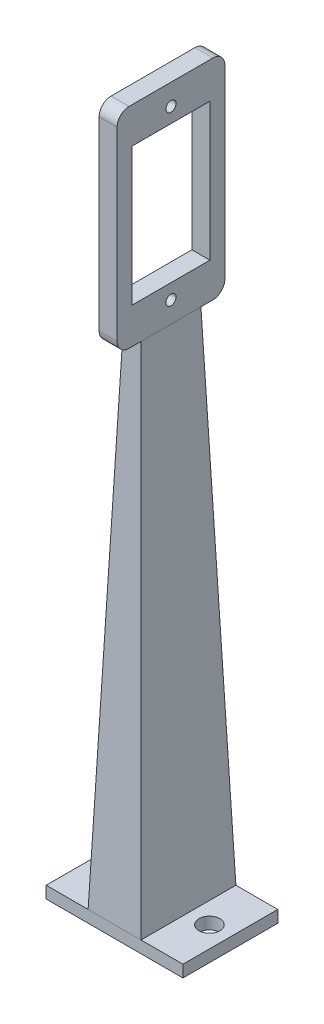
ISO-10303-21;
HEADER;
FILE_DESCRIPTION(('STEP AP214'),'2;1');
FILE_NAME('part.step','',(''),(''),'','','');
FILE_SCHEMA(('AUTOMOTIVE_DESIGN { 1 0 10303 214 1 1 1 1 }'));
ENDSEC;
DATA;
#1=APPLICATION_CONTEXT('core data for automotive mechanical design processes');
#2=APPLICATION_PROTOCOL_DEFINITION('international standard','automotive_design',2000,#1);
#3=PRODUCT_CONTEXT('',#1,'mechanical');
#4=PRODUCT('Part','Part','',(#3));
#5=PRODUCT_RELATED_PRODUCT_CATEGORY('part','',(#4));
#6=PRODUCT_DEFINITION_FORMATION('','',#4);
#7=PRODUCT_DEFINITION_CONTEXT('part definition',#1,'design');
#8=PRODUCT_DEFINITION('design','',#6,#7);
#9=PRODUCT_DEFINITION_SHAPE('','',#8);
#10=(LENGTH_UNIT() NAMED_UNIT(*) SI_UNIT(.MILLI.,.METRE.));
#11=(NAMED_UNIT(*) PLANE_ANGLE_UNIT() SI_UNIT($,.RADIAN.));
#12=(NAMED_UNIT(*) SI_UNIT($,.STERADIAN.) SOLID_ANGLE_UNIT());
#13=UNCERTAINTY_MEASURE_WITH_UNIT(LENGTH_MEASURE(1.E-05),#10,'distance_accuracy_value','');
#14=(GEOMETRIC_REPRESENTATION_CONTEXT(3) GLOBAL_UNCERTAINTY_ASSIGNED_CONTEXT((#13)) GLOBAL_UNIT_ASSIGNED_CONTEXT((#10,
#11,#12)) REPRESENTATION_CONTEXT('',''));
#15=CARTESIAN_POINT('',(0.,0.,0.));
#16=DIRECTION('',(0.,0.,1.));
#17=DIRECTION('',(1.,0.,0.));
#18=AXIS2_PLACEMENT_3D('',#15,#16,#17);
#19=CARTESIAN_POINT('',(1.5,-17.5,9.));
#20=DIRECTION('',(0.,1.,0.));
#21=DIRECTION('',(0.,0.,1.));
#22=AXIS2_PLACEMENT_3D('',#19,#20,#21);
#23=PLANE('',#22);
#24=DIRECTION('',(1.,0.,0.));
#25=VECTOR('',#24,1.);
#26=CARTESIAN_POINT('',(-1.5,-17.5,-5.));
#27=LINE('',#26,#25);
#28=CARTESIAN_POINT('',(-1.5,-17.5,-5.));
#29=VERTEX_POINT('',#28);
#30=CARTESIAN_POINT('',(1.5,-17.5,-5.));
#31=VERTEX_POINT('',#30);
#32=EDGE_CURVE('E200',#29,#31,#27,.T.);
#33=ORIENTED_EDGE('',*,*,#32,.F.);
#34=DIRECTION('',(0.,0.,-1.));
#35=VECTOR('',#34,1.);
#36=CARTESIAN_POINT('',(-1.5,-17.5,9.));
#37=LINE('',#36,#35);
#38=CARTESIAN_POINT('',(-1.5,-17.5,-7.));
#39=VERTEX_POINT('',#38);
#40=EDGE_CURVE('E302',#29,#39,#37,.T.);
#41=ORIENTED_EDGE('',*,*,#40,.T.);
#42=DIRECTION('',(-1.,0.,0.));
#43=VECTOR('',#42,1.);
#44=CARTESIAN_POINT('',(1.5,-17.5,-7.));
#45=LINE('',#44,#43);
#46=CARTESIAN_POINT('',(1.5,-17.5,-7.));
#47=VERTEX_POINT('',#46);
#48=EDGE_CURVE('E293',#39,#47,#45,.F.);
#49=ORIENTED_EDGE('',*,*,#48,.T.);
#50=DIRECTION('',(0.,0.,-1.));
#51=VECTOR('',#50,1.);
#52=CARTESIAN_POINT('',(1.5,-17.5,9.));
#53=LINE('',#52,#51);
#54=EDGE_CURVE('E47',#31,#47,#53,.T.);
#55=ORIENTED_EDGE('',*,*,#54,.F.);
#56=EDGE_LOOP('',(#33,#41,#49,#55));
#57=FACE_BOUND('',#56,.T.);
#58=ADVANCED_FACE('F32',(#57),#23,.F.);
#59=DIRECTION('',(-1.,0.,0.));
#60=VECTOR('',#59,1.);
#61=CARTESIAN_POINT('',(-1.5,-17.5,5.));
#62=LINE('',#61,#60);
#63=CARTESIAN_POINT('',(1.5,-17.5,5.));
#64=VERTEX_POINT('',#63);
#65=CARTESIAN_POINT('',(-1.5,-17.5,5.));
#66=VERTEX_POINT('',#65);
#67=EDGE_CURVE('E55',#64,#66,#62,.T.);
#68=ORIENTED_EDGE('',*,*,#67,.F.);
#69=CARTESIAN_POINT('',(1.5,-17.5,7.));
#70=VERTEX_POINT('',#69);
#71=EDGE_CURVE('E291',#70,#64,#53,.T.);
#72=ORIENTED_EDGE('',*,*,#71,.F.);
#73=DIRECTION('',(-1.,0.,0.));
#74=VECTOR('',#73,1.);
#75=CARTESIAN_POINT('',(1.5,-17.5,7.));
#76=LINE('',#75,#74);
#77=CARTESIAN_POINT('',(-1.5,-17.5,7.));
#78=VERTEX_POINT('',#77);
#79=EDGE_CURVE('E305',#70,#78,#76,.T.);
#80=ORIENTED_EDGE('',*,*,#79,.T.);
#81=EDGE_CURVE('E285',#78,#66,#37,.T.);
#82=ORIENTED_EDGE('',*,*,#81,.T.);
#83=EDGE_LOOP('',(#68,#72,#80,#82));
#84=FACE_BOUND('',#83,.T.);
#85=ADVANCED_FACE('F362',(#84),#23,.F.);
#86=CARTESIAN_POINT('',(1.5,-17.5,-9.));
#87=DIRECTION('',(0.,0.,1.));
#88=DIRECTION('',(1.,0.,0.));
#89=AXIS2_PLACEMENT_3D('',#86,#87,#88);
#90=PLANE('',#89);
#91=DIRECTION('',(0.,1.,0.));
#92=VECTOR('',#91,1.);
#93=CARTESIAN_POINT('',(1.5,-17.5,-9.));
#94=LINE('',#93,#92);
#95=CARTESIAN_POINT('',(1.5,-15.5,-9.));
#96=VERTEX_POINT('',#95);
#97=CARTESIAN_POINT('',(1.5,15.5,-9.));
#98=VERTEX_POINT('',#97);
#99=EDGE_CURVE('E281',#96,#98,#94,.T.);
#100=ORIENTED_EDGE('',*,*,#99,.F.);
#101=DIRECTION('',(-1.,0.,0.));
#102=VECTOR('',#101,1.);
#103=CARTESIAN_POINT('',(1.5,-15.5,-9.));
#104=LINE('',#103,#102);
#105=CARTESIAN_POINT('',(-1.5,-15.5,-9.));
#106=VERTEX_POINT('',#105);
#107=EDGE_CURVE('E332',#96,#106,#104,.T.);
#108=ORIENTED_EDGE('',*,*,#107,.T.);
#109=DIRECTION('',(0.,1.,0.));
#110=VECTOR('',#109,1.);
#111=CARTESIAN_POINT('',(-1.5,-17.5,-9.));
#112=LINE('',#111,#110);
#113=CARTESIAN_POINT('',(-1.5,15.5,-9.));
#114=VERTEX_POINT('',#113);
#115=EDGE_CURVE('E280',#106,#114,#112,.T.);
#116=ORIENTED_EDGE('',*,*,#115,.T.);
#117=DIRECTION('',(-1.,0.,0.));
#118=VECTOR('',#117,1.);
#119=CARTESIAN_POINT('',(1.5,15.5,-9.));
#120=LINE('',#119,#118);
#121=EDGE_CURVE('E330',#114,#98,#120,.F.);
#122=ORIENTED_EDGE('',*,*,#121,.T.);
#123=EDGE_LOOP('',(#100,#108,#116,#122));
#124=FACE_BOUND('',#123,.T.);
#125=ADVANCED_FACE('F418',(#124),#90,.F.);
#126=CARTESIAN_POINT('',(1.5,17.5,9.));
#127=DIRECTION('',(0.,-1.,0.));
#128=DIRECTION('',(0.,0.,-1.));
#129=AXIS2_PLACEMENT_3D('',#126,#127,#128);
#130=PLANE('',#129);
#131=DIRECTION('',(0.,0.,1.));
#132=VECTOR('',#131,1.);
#133=CARTESIAN_POINT('',(-1.5,17.5,9.));
#134=LINE('',#133,#132);
#135=CARTESIAN_POINT('',(-1.5,17.5,-7.));
#136=VERTEX_POINT('',#135);
#137=CARTESIAN_POINT('',(-1.5,17.5,7.));
#138=VERTEX_POINT('',#137);
#139=EDGE_CURVE('E296',#136,#138,#134,.T.);
#140=ORIENTED_EDGE('',*,*,#139,.T.);
#141=DIRECTION('',(-1.,0.,0.));
#142=VECTOR('',#141,1.);
#143=CARTESIAN_POINT('',(1.5,17.5,7.));
#144=LINE('',#143,#142);
#145=CARTESIAN_POINT('',(1.5,17.5,7.));
#146=VERTEX_POINT('',#145);
#147=EDGE_CURVE('E11',#138,#146,#144,.F.);
#148=ORIENTED_EDGE('',*,*,#147,.T.);
#149=DIRECTION('',(0.,0.,1.));
#150=VECTOR('',#149,1.);
#151=CARTESIAN_POINT('',(1.5,17.5,9.));
#152=LINE('',#151,#150);
#153=CARTESIAN_POINT('',(1.5,17.5,-7.));
#154=VERTEX_POINT('',#153);
#155=EDGE_CURVE('E284',#154,#146,#152,.T.);
#156=ORIENTED_EDGE('',*,*,#155,.F.);
#157=DIRECTION('',(-1.,0.,0.));
#158=VECTOR('',#157,1.);
#159=CARTESIAN_POINT('',(1.5,17.5,-7.));
#160=LINE('',#159,#158);
#161=EDGE_CURVE('E40',#154,#136,#160,.T.);
#162=ORIENTED_EDGE('',*,*,#161,.T.);
#163=EDGE_LOOP('',(#140,#148,#156,#162));
#164=FACE_BOUND('',#163,.T.);
#165=ADVANCED_FACE('F339',(#164),#130,.F.);
#166=CARTESIAN_POINT('',(1.5,-17.5,9.));
#167=DIRECTION('',(0.,0.,-1.));
#168=DIRECTION('',(-1.,0.,0.));
#169=AXIS2_PLACEMENT_3D('',#166,#167,#168);
#170=PLANE('',#169);
#171=DIRECTION('',(0.,-1.,0.));
#172=VECTOR('',#171,1.);
#173=CARTESIAN_POINT('',(-1.5,-17.5,9.));
#174=LINE('',#173,#172);
#175=CARTESIAN_POINT('',(-1.5,15.5,9.));
#176=VERTEX_POINT('',#175);
#177=CARTESIAN_POINT('',(-1.5,-15.5,9.));
#178=VERTEX_POINT('',#177);
#179=EDGE_CURVE('E299',#176,#178,#174,.T.);
#180=ORIENTED_EDGE('',*,*,#179,.T.);
#181=DIRECTION('',(-1.,0.,0.));
#182=VECTOR('',#181,1.);
#183=CARTESIAN_POINT('',(1.5,-15.5,9.));
#184=LINE('',#183,#182);
#185=CARTESIAN_POINT('',(1.5,-15.5,9.));
#186=VERTEX_POINT('',#185);
#187=EDGE_CURVE('E320',#178,#186,#184,.F.);
#188=ORIENTED_EDGE('',*,*,#187,.T.);
#189=DIRECTION('',(0.,-1.,0.));
#190=VECTOR('',#189,1.);
#191=CARTESIAN_POINT('',(1.5,-17.5,9.));
#192=LINE('',#191,#190);
#193=CARTESIAN_POINT('',(1.5,15.5,9.));
#194=VERTEX_POINT('',#193);
#195=EDGE_CURVE('E288',#194,#186,#192,.T.);
#196=ORIENTED_EDGE('',*,*,#195,.F.);
#197=DIRECTION('',(-1.,0.,0.));
#198=VECTOR('',#197,1.);
#199=CARTESIAN_POINT('',(1.5,15.5,9.));
#200=LINE('',#199,#198);
#201=EDGE_CURVE('E317',#194,#176,#200,.T.);
#202=ORIENTED_EDGE('',*,*,#201,.T.);
#203=EDGE_LOOP('',(#180,#188,#196,#202));
#204=FACE_BOUND('',#203,.T.);
#205=ADVANCED_FACE('F354',(#204),#170,.F.);
#206=CARTESIAN_POINT('',(1.5,0.,0.));
#207=DIRECTION('',(-1.,0.,0.));
#208=DIRECTION('',(0.,0.,1.));
#209=AXIS2_PLACEMENT_3D('',#206,#207,#208);
#210=PLANE('',#209);
#211=CARTESIAN_POINT('',(1.5,-14.,0.));
#212=DIRECTION('',(-1.,0.,0.));
#213=DIRECTION('',(0.,0.,1.));
#214=AXIS2_PLACEMENT_3D('',#211,#212,#213);
#215=CIRCLE('',#214,0.85);
#216=CARTESIAN_POINT('',(1.5,-14.,0.85));
#217=VERTEX_POINT('',#216);
#218=EDGE_CURVE('E239',#217,#217,#215,.F.);
#219=ORIENTED_EDGE('',*,*,#218,.F.);
#220=EDGE_LOOP('',(#219));
#221=FACE_BOUND('',#220,.T.);
#222=CARTESIAN_POINT('',(1.5,14.,0.));
#223=DIRECTION('',(-1.,0.,0.));
#224=DIRECTION('',(0.,0.,1.));
#225=AXIS2_PLACEMENT_3D('',#222,#223,#224);
#226=CIRCLE('',#225,0.85);
#227=CARTESIAN_POINT('',(1.5,14.,0.85));
#228=VERTEX_POINT('',#227);
#229=EDGE_CURVE('E245',#228,#228,#226,.F.);
#230=ORIENTED_EDGE('',*,*,#229,.F.);
#231=EDGE_LOOP('',(#230));
#232=FACE_BOUND('',#231,.T.);
#233=DIRECTION('',(0.,0.,-1.));
#234=VECTOR('',#233,1.);
#235=CARTESIAN_POINT('',(1.5,-11.5,-6.5));
#236=LINE('',#235,#234);
#237=CARTESIAN_POINT('',(1.5,-11.5,6.5));
#238=VERTEX_POINT('',#237);
#239=CARTESIAN_POINT('',(1.5,-11.5,-6.5));
#240=VERTEX_POINT('',#239);
#241=EDGE_CURVE('E259',#238,#240,#236,.T.);
#242=ORIENTED_EDGE('',*,*,#241,.F.);
#243=DIRECTION('',(0.,-1.,0.));
#244=VECTOR('',#243,1.);
#245=CARTESIAN_POINT('',(1.5,-11.5,6.5));
#246=LINE('',#245,#244);
#247=CARTESIAN_POINT('',(1.5,11.5,6.5));
#248=VERTEX_POINT('',#247);
#249=EDGE_CURVE('E257',#248,#238,#246,.T.);
#250=ORIENTED_EDGE('',*,*,#249,.F.);
#251=DIRECTION('',(0.,0.,1.));
#252=VECTOR('',#251,1.);
#253=CARTESIAN_POINT('',(1.5,11.5,-6.5));
#254=LINE('',#253,#252);
#255=CARTESIAN_POINT('',(1.5,11.5,-6.5));
#256=VERTEX_POINT('',#255);
#257=EDGE_CURVE('E265',#256,#248,#254,.T.);
#258=ORIENTED_EDGE('',*,*,#257,.F.);
#259=DIRECTION('',(0.,1.,0.));
#260=VECTOR('',#259,1.);
#261=CARTESIAN_POINT('',(1.5,-11.5,-6.5));
#262=LINE('',#261,#260);
#263=EDGE_CURVE('E262',#240,#256,#262,.T.);
#264=ORIENTED_EDGE('',*,*,#263,.F.);
#265=EDGE_LOOP('',(#242,#250,#258,#264));
#266=FACE_BOUND('',#265,.T.);
#267=ORIENTED_EDGE('',*,*,#195,.T.);
#268=CARTESIAN_POINT('',(1.5,-15.5,7.));
#269=DIRECTION('',(-1.,0.,0.));
#270=DIRECTION('',(0.,0.,1.));
#271=AXIS2_PLACEMENT_3D('',#268,#269,#270);
#272=CIRCLE('',#271,2.);
#273=EDGE_CURVE('E328',#186,#70,#272,.F.);
#274=ORIENTED_EDGE('',*,*,#273,.T.);
#275=ORIENTED_EDGE('',*,*,#71,.T.);
#276=DIRECTION('',(0.,0.,1.));
#277=VECTOR('',#276,1.);
#278=CARTESIAN_POINT('',(1.5,-17.5,5.));
#279=LINE('',#278,#277);
#280=EDGE_CURVE('E208',#31,#64,#279,.T.);
#281=ORIENTED_EDGE('',*,*,#280,.F.);
#282=ORIENTED_EDGE('',*,*,#54,.T.);
#283=CARTESIAN_POINT('',(1.5,-15.5,-7.));
#284=DIRECTION('',(-1.,0.,0.));
#285=DIRECTION('',(0.,0.,1.));
#286=AXIS2_PLACEMENT_3D('',#283,#284,#285);
#287=CIRCLE('',#286,2.);
#288=EDGE_CURVE('E326',#47,#96,#287,.F.);
#289=ORIENTED_EDGE('',*,*,#288,.T.);
#290=ORIENTED_EDGE('',*,*,#99,.T.);
#291=CARTESIAN_POINT('',(1.5,15.5,-7.));
#292=DIRECTION('',(-1.,0.,0.));
#293=DIRECTION('',(0.,0.,1.));
#294=AXIS2_PLACEMENT_3D('',#291,#292,#293);
#295=CIRCLE('',#294,2.);
#296=EDGE_CURVE('E322',#98,#154,#295,.F.);
#297=ORIENTED_EDGE('',*,*,#296,.T.);
#298=ORIENTED_EDGE('',*,*,#155,.T.);
#299=CARTESIAN_POINT('',(1.5,15.5,7.));
#300=DIRECTION('',(-1.,0.,0.));
#301=DIRECTION('',(0.,0.,1.));
#302=AXIS2_PLACEMENT_3D('',#299,#300,#301);
#303=CIRCLE('',#302,2.);
#304=EDGE_CURVE('E324',#146,#194,#303,.F.);
#305=ORIENTED_EDGE('',*,*,#304,.T.);
#306=EDGE_LOOP('',(#267,#274,#275,#281,#282,#289,#290,#297,#298,#305));
#307=FACE_BOUND('',#306,.T.);
#308=ADVANCED_FACE('F358',(#221,#232,#266,#307),#210,.F.);
#309=CARTESIAN_POINT('',(-1.5,0.,0.));
#310=DIRECTION('',(-1.,0.,0.));
#311=DIRECTION('',(0.,0.,1.));
#312=AXIS2_PLACEMENT_3D('',#309,#310,#311);
#313=PLANE('',#312);
#314=CARTESIAN_POINT('',(-1.5,-14.,0.));
#315=DIRECTION('',(-1.,0.,0.));
#316=DIRECTION('',(0.,0.,1.));
#317=AXIS2_PLACEMENT_3D('',#314,#315,#316);
#318=CIRCLE('',#317,0.85);
#319=CARTESIAN_POINT('',(-1.5,-14.,0.85));
#320=VERTEX_POINT('',#319);
#321=EDGE_CURVE('E216',#320,#320,#318,.T.);
#322=ORIENTED_EDGE('',*,*,#321,.F.);
#323=EDGE_LOOP('',(#322));
#324=FACE_BOUND('',#323,.T.);
#325=CARTESIAN_POINT('',(-1.5,14.,0.));
#326=DIRECTION('',(-1.,0.,0.));
#327=DIRECTION('',(0.,0.,1.));
#328=AXIS2_PLACEMENT_3D('',#325,#326,#327);
#329=CIRCLE('',#328,0.85);
#330=CARTESIAN_POINT('',(-1.5,14.,0.85));
#331=VERTEX_POINT('',#330);
#332=EDGE_CURVE('E242',#331,#331,#329,.T.);
#333=ORIENTED_EDGE('',*,*,#332,.F.);
#334=EDGE_LOOP('',(#333));
#335=FACE_BOUND('',#334,.T.);
#336=DIRECTION('',(0.,-1.,0.));
#337=VECTOR('',#336,1.);
#338=CARTESIAN_POINT('',(-1.5,-11.5,6.5));
#339=LINE('',#338,#337);
#340=CARTESIAN_POINT('',(-1.5,11.5,6.5));
#341=VERTEX_POINT('',#340);
#342=CARTESIAN_POINT('',(-1.5,-11.5,6.5));
#343=VERTEX_POINT('',#342);
#344=EDGE_CURVE('E254',#341,#343,#339,.T.);
#345=ORIENTED_EDGE('',*,*,#344,.T.);
#346=DIRECTION('',(0.,0.,-1.));
#347=VECTOR('',#346,1.);
#348=CARTESIAN_POINT('',(-1.5,-11.5,-6.5));
#349=LINE('',#348,#347);
#350=CARTESIAN_POINT('',(-1.5,-11.5,-6.5));
#351=VERTEX_POINT('',#350);
#352=EDGE_CURVE('E271',#343,#351,#349,.T.);
#353=ORIENTED_EDGE('',*,*,#352,.T.);
#354=DIRECTION('',(0.,1.,0.));
#355=VECTOR('',#354,1.);
#356=CARTESIAN_POINT('',(-1.5,-11.5,-6.5));
#357=LINE('',#356,#355);
#358=CARTESIAN_POINT('',(-1.5,11.5,-6.5));
#359=VERTEX_POINT('',#358);
#360=EDGE_CURVE('E248',#351,#359,#357,.T.);
#361=ORIENTED_EDGE('',*,*,#360,.T.);
#362=DIRECTION('',(0.,0.,1.));
#363=VECTOR('',#362,1.);
#364=CARTESIAN_POINT('',(-1.5,11.5,-6.5));
#365=LINE('',#364,#363);
#366=EDGE_CURVE('E251',#359,#341,#365,.T.);
#367=ORIENTED_EDGE('',*,*,#366,.T.);
#368=EDGE_LOOP('',(#345,#353,#361,#367));
#369=FACE_BOUND('',#368,.T.);
#370=ORIENTED_EDGE('',*,*,#81,.F.);
#371=CARTESIAN_POINT('',(-1.5,-15.5,7.));
#372=DIRECTION('',(-1.,0.,0.));
#373=DIRECTION('',(0.,0.,1.));
#374=AXIS2_PLACEMENT_3D('',#371,#372,#373);
#375=CIRCLE('',#374,2.);
#376=EDGE_CURVE('E315',#78,#178,#375,.T.);
#377=ORIENTED_EDGE('',*,*,#376,.T.);
#378=ORIENTED_EDGE('',*,*,#179,.F.);
#379=CARTESIAN_POINT('',(-1.5,15.5,7.));
#380=DIRECTION('',(-1.,0.,0.));
#381=DIRECTION('',(0.,0.,1.));
#382=AXIS2_PLACEMENT_3D('',#379,#380,#381);
#383=CIRCLE('',#382,2.);
#384=EDGE_CURVE('E310',#176,#138,#383,.T.);
#385=ORIENTED_EDGE('',*,*,#384,.T.);
#386=ORIENTED_EDGE('',*,*,#139,.F.);
#387=CARTESIAN_POINT('',(-1.5,15.5,-7.));
#388=DIRECTION('',(-1.,0.,0.));
#389=DIRECTION('',(0.,0.,1.));
#390=AXIS2_PLACEMENT_3D('',#387,#388,#389);
#391=CIRCLE('',#390,2.);
#392=EDGE_CURVE('E308',#136,#114,#391,.T.);
#393=ORIENTED_EDGE('',*,*,#392,.T.);
#394=ORIENTED_EDGE('',*,*,#115,.F.);
#395=CARTESIAN_POINT('',(-1.5,-15.5,-7.));
#396=DIRECTION('',(-1.,0.,0.));
#397=DIRECTION('',(0.,0.,1.));
#398=AXIS2_PLACEMENT_3D('',#395,#396,#397);
#399=CIRCLE('',#398,2.);
#400=EDGE_CURVE('E312',#106,#39,#399,.T.);
#401=ORIENTED_EDGE('',*,*,#400,.T.);
#402=ORIENTED_EDGE('',*,*,#40,.F.);
#403=DIRECTION('',(0.,0.,-1.));
#404=VECTOR('',#403,1.);
#405=CARTESIAN_POINT('',(-1.5,-17.5,5.));
#406=LINE('',#405,#404);
#407=EDGE_CURVE('E197',#66,#29,#406,.T.);
#408=ORIENTED_EDGE('',*,*,#407,.F.);
#409=EDGE_LOOP('',(#370,#377,#378,#385,#386,#393,#394,#401,#402,#408));
#410=FACE_BOUND('',#409,.T.);
#411=ADVANCED_FACE('F345',(#324,#335,#369,#410),#313,.T.);
#412=CARTESIAN_POINT('',(-1.501,-11.5,6.5));
#413=DIRECTION('',(0.,0.,1.));
#414=DIRECTION('',(1.,0.,0.));
#415=AXIS2_PLACEMENT_3D('',#412,#413,#414);
#416=PLANE('',#415);
#417=DIRECTION('',(1.,0.,0.));
#418=VECTOR('',#417,1.);
#419=CARTESIAN_POINT('',(-1.501,11.5,6.5));
#420=LINE('',#419,#418);
#421=EDGE_CURVE('E269',#341,#248,#420,.T.);
#422=ORIENTED_EDGE('',*,*,#421,.T.);
#423=ORIENTED_EDGE('',*,*,#249,.T.);
#424=DIRECTION('',(1.,0.,0.));
#425=VECTOR('',#424,1.);
#426=CARTESIAN_POINT('',(-1.501,-11.5,6.5));
#427=LINE('',#426,#425);
#428=EDGE_CURVE('E268',#343,#238,#427,.T.);
#429=ORIENTED_EDGE('',*,*,#428,.F.);
#430=ORIENTED_EDGE('',*,*,#344,.F.);
#431=EDGE_LOOP('',(#422,#423,#429,#430));
#432=FACE_BOUND('',#431,.T.);
#433=ADVANCED_FACE('F469',(#432),#416,.F.);
#434=CARTESIAN_POINT('',(-1.501,11.5,-6.5));
#435=DIRECTION('',(0.,1.,0.));
#436=DIRECTION('',(0.,0.,1.));
#437=AXIS2_PLACEMENT_3D('',#434,#435,#436);
#438=PLANE('',#437);
#439=DIRECTION('',(1.,0.,0.));
#440=VECTOR('',#439,1.);
#441=CARTESIAN_POINT('',(-1.501,11.5,-6.5));
#442=LINE('',#441,#440);
#443=EDGE_CURVE('E272',#359,#256,#442,.T.);
#444=ORIENTED_EDGE('',*,*,#443,.T.);
#445=ORIENTED_EDGE('',*,*,#257,.T.);
#446=ORIENTED_EDGE('',*,*,#421,.F.);
#447=ORIENTED_EDGE('',*,*,#366,.F.);
#448=EDGE_LOOP('',(#444,#445,#446,#447));
#449=FACE_BOUND('',#448,.T.);
#450=ADVANCED_FACE('F465',(#449),#438,.F.);
#451=CARTESIAN_POINT('',(-1.501,-11.5,-6.5));
#452=DIRECTION('',(0.,0.,-1.));
#453=DIRECTION('',(-1.,0.,0.));
#454=AXIS2_PLACEMENT_3D('',#451,#452,#453);
#455=PLANE('',#454);
#456=DIRECTION('',(1.,0.,0.));
#457=VECTOR('',#456,1.);
#458=CARTESIAN_POINT('',(-1.501,-11.5,-6.5));
#459=LINE('',#458,#457);
#460=EDGE_CURVE('E274',#351,#240,#459,.T.);
#461=ORIENTED_EDGE('',*,*,#460,.T.);
#462=ORIENTED_EDGE('',*,*,#263,.T.);
#463=ORIENTED_EDGE('',*,*,#443,.F.);
#464=ORIENTED_EDGE('',*,*,#360,.F.);
#465=EDGE_LOOP('',(#461,#462,#463,#464));
#466=FACE_BOUND('',#465,.T.);
#467=ADVANCED_FACE('F468',(#466),#455,.F.);
#468=CARTESIAN_POINT('',(-1.501,-11.5,-6.5));
#469=DIRECTION('',(0.,-1.,0.));
#470=DIRECTION('',(0.,0.,-1.));
#471=AXIS2_PLACEMENT_3D('',#468,#469,#470);
#472=PLANE('',#471);
#473=ORIENTED_EDGE('',*,*,#428,.T.);
#474=ORIENTED_EDGE('',*,*,#241,.T.);
#475=ORIENTED_EDGE('',*,*,#460,.F.);
#476=ORIENTED_EDGE('',*,*,#352,.F.);
#477=EDGE_LOOP('',(#473,#474,#475,#476));
#478=FACE_BOUND('',#477,.T.);
#479=ADVANCED_FACE('F463',(#478),#472,.F.);
#480=CARTESIAN_POINT('',(1.501,14.,0.));
#481=DIRECTION('',(-1.,0.,0.));
#482=DIRECTION('',(0.,0.,1.));
#483=AXIS2_PLACEMENT_3D('',#480,#481,#482);
#484=CYLINDRICAL_SURFACE('',#483,0.85);
#485=CARTESIAN_POINT('',(-1.5,14.,0.85));
#486=CARTESIAN_POINT('',(-1.46875,14.,0.85));
#487=CARTESIAN_POINT('',(-1.4375,14.,0.85));
#488=CARTESIAN_POINT('',(-1.375,14.,0.85));
#489=CARTESIAN_POINT('',(-1.34375,14.,0.85));
#490=CARTESIAN_POINT('',(-1.28125,14.,0.85));
#491=CARTESIAN_POINT('',(-1.25,14.,0.85));
#492=CARTESIAN_POINT('',(-1.1875,14.,0.85));
#493=CARTESIAN_POINT('',(-1.15625,14.,0.85));
#494=CARTESIAN_POINT('',(-1.09375,14.,0.85));
#495=CARTESIAN_POINT('',(-1.0625,14.,0.85));
#496=CARTESIAN_POINT('',(-1.,14.,0.85));
#497=CARTESIAN_POINT('',(-0.96875,14.,0.85));
#498=CARTESIAN_POINT('',(-0.90625,14.,0.85));
#499=CARTESIAN_POINT('',(-0.874999999999999,14.,0.85));
#500=CARTESIAN_POINT('',(-0.8125,14.,0.85));
#501=CARTESIAN_POINT('',(-0.78125,14.,0.85));
#502=CARTESIAN_POINT('',(-0.71875,14.,0.85));
#503=CARTESIAN_POINT('',(-0.6875,14.,0.85));
#504=CARTESIAN_POINT('',(-0.625,14.,0.85));
#505=CARTESIAN_POINT('',(-0.59375,14.,0.85));
#506=CARTESIAN_POINT('',(-0.53125,14.,0.85));
#507=CARTESIAN_POINT('',(-0.5,14.,0.85));
#508=CARTESIAN_POINT('',(-0.4375,14.,0.85));
#509=CARTESIAN_POINT('',(-0.40625,14.,0.85));
#510=CARTESIAN_POINT('',(-0.34375,14.,0.85));
#511=CARTESIAN_POINT('',(-0.3125,14.,0.85));
#512=CARTESIAN_POINT('',(-0.25,14.,0.85));
#513=CARTESIAN_POINT('',(-0.21875,14.,0.85));
#514=CARTESIAN_POINT('',(-0.15625,14.,0.85));
#515=CARTESIAN_POINT('',(-0.125,14.,0.85));
#516=CARTESIAN_POINT('',(-0.0624999999999998,14.,0.85));
#517=CARTESIAN_POINT('',(-0.0312499999999998,14.,0.85));
#518=CARTESIAN_POINT('',(0.0312500000000002,14.,0.85));
#519=CARTESIAN_POINT('',(0.0625000000000003,14.,0.85));
#520=CARTESIAN_POINT('',(0.125,14.,0.85));
#521=CARTESIAN_POINT('',(0.15625,14.,0.85));
#522=CARTESIAN_POINT('',(0.21875,14.,0.85));
#523=CARTESIAN_POINT('',(0.25,14.,0.85));
#524=CARTESIAN_POINT('',(0.3125,14.,0.85));
#525=CARTESIAN_POINT('',(0.34375,14.,0.85));
#526=CARTESIAN_POINT('',(0.40625,14.,0.85));
#527=CARTESIAN_POINT('',(0.4375,14.,0.85));
#528=CARTESIAN_POINT('',(0.5,14.,0.85));
#529=CARTESIAN_POINT('',(0.53125,14.,0.85));
#530=CARTESIAN_POINT('',(0.59375,14.,0.85));
#531=CARTESIAN_POINT('',(0.625,14.,0.85));
#532=CARTESIAN_POINT('',(0.6875,14.,0.85));
#533=CARTESIAN_POINT('',(0.71875,14.,0.85));
#534=CARTESIAN_POINT('',(0.78125,14.,0.85));
#535=CARTESIAN_POINT('',(0.8125,14.,0.85));
#536=CARTESIAN_POINT('',(0.875,14.,0.85));
#537=CARTESIAN_POINT('',(0.90625,14.,0.85));
#538=CARTESIAN_POINT('',(0.96875,14.,0.85));
#539=CARTESIAN_POINT('',(1.,14.,0.85));
#540=CARTESIAN_POINT('',(1.0625,14.,0.85));
#541=CARTESIAN_POINT('',(1.09375,14.,0.85));
#542=CARTESIAN_POINT('',(1.15625,14.,0.85));
#543=CARTESIAN_POINT('',(1.1875,14.,0.85));
#544=CARTESIAN_POINT('',(1.25,14.,0.85));
#545=CARTESIAN_POINT('',(1.28125,14.,0.85));
#546=CARTESIAN_POINT('',(1.34375,14.,0.85));
#547=CARTESIAN_POINT('',(1.375,14.,0.85));
#548=CARTESIAN_POINT('',(1.4375,14.,0.85));
#549=CARTESIAN_POINT('',(1.46875,14.,0.85));
#550=CARTESIAN_POINT('',(1.5,14.,0.85));
#551=B_SPLINE_CURVE_WITH_KNOTS('',3,(#485,#486,#487,#488,#489,#490,#491,#492,#493,#494,#495,
#496,#497,#498,#499,#500,#501,#502,#503,#504,#505,#506,#507,#508,#509,#510,#511,#512,#513,#514,
#515,#516,#517,#518,#519,#520,#521,#522,#523,#524,#525,#526,#527,#528,#529,#530,#531,#532,#533,
#534,#535,#536,#537,#538,#539,#540,#541,#542,#543,#544,#545,#546,#547,#548,#549,#550),
.UNSPECIFIED.,.F.,.F.,(4,2,2,2,2,2,2,2,2,2,2,2,2,2,2,2,2,2,2,2,2,2,2,2,2,2,2,2,2,2,2,2,4),(0.,
0.0937500000000001,0.1875,0.28125,0.375,0.46875,0.5625,0.65625,0.75,0.84375,0.9375,1.03125,
1.125,1.21875,1.3125,1.40625,1.5,1.59375,1.6875,1.78125,1.875,1.96875,2.0625,2.15625,2.25,
2.34375,2.4375,2.53125,2.625,2.71875,2.8125,2.90625,3.),.UNSPECIFIED.);
#552=EDGE_CURVE('BSEAM459',#331,#228,#551,.T.);
#553=ORIENTED_EDGE('',*,*,#332,.T.);
#554=ORIENTED_EDGE('',*,*,#229,.T.);
#555=ORIENTED_EDGE('',*,*,#552,.T.);
#556=ORIENTED_EDGE('',*,*,#552,.F.);
#557=EDGE_LOOP('',(#553,#555,#554,#556));
#558=FACE_BOUND('',#557,.T.);
#559=ADVANCED_FACE('F459',(#558),#484,.F.);
#560=CARTESIAN_POINT('',(1.501,-14.,0.));
#561=DIRECTION('',(-1.,0.,0.));
#562=DIRECTION('',(0.,0.,1.));
#563=AXIS2_PLACEMENT_3D('',#560,#561,#562);
#564=CYLINDRICAL_SURFACE('',#563,0.85);
#565=CARTESIAN_POINT('',(-1.5,-14.,0.85));
#566=CARTESIAN_POINT('',(-1.46875,-14.,0.85));
#567=CARTESIAN_POINT('',(-1.4375,-14.,0.85));
#568=CARTESIAN_POINT('',(-1.375,-14.,0.85));
#569=CARTESIAN_POINT('',(-1.34375,-14.,0.85));
#570=CARTESIAN_POINT('',(-1.28125,-14.,0.85));
#571=CARTESIAN_POINT('',(-1.25,-14.,0.85));
#572=CARTESIAN_POINT('',(-1.1875,-14.,0.85));
#573=CARTESIAN_POINT('',(-1.15625,-14.,0.85));
#574=CARTESIAN_POINT('',(-1.09375,-14.,0.85));
#575=CARTESIAN_POINT('',(-1.0625,-14.,0.85));
#576=CARTESIAN_POINT('',(-1.,-14.,0.85));
#577=CARTESIAN_POINT('',(-0.96875,-14.,0.85));
#578=CARTESIAN_POINT('',(-0.90625,-14.,0.85));
#579=CARTESIAN_POINT('',(-0.874999999999999,-14.,0.85));
#580=CARTESIAN_POINT('',(-0.8125,-14.,0.85));
#581=CARTESIAN_POINT('',(-0.78125,-14.,0.85));
#582=CARTESIAN_POINT('',(-0.71875,-14.,0.85));
#583=CARTESIAN_POINT('',(-0.6875,-14.,0.85));
#584=CARTESIAN_POINT('',(-0.625,-14.,0.85));
#585=CARTESIAN_POINT('',(-0.59375,-14.,0.85));
#586=CARTESIAN_POINT('',(-0.53125,-14.,0.85));
#587=CARTESIAN_POINT('',(-0.5,-14.,0.85));
#588=CARTESIAN_POINT('',(-0.4375,-14.,0.85));
#589=CARTESIAN_POINT('',(-0.40625,-14.,0.85));
#590=CARTESIAN_POINT('',(-0.34375,-14.,0.85));
#591=CARTESIAN_POINT('',(-0.3125,-14.,0.85));
#592=CARTESIAN_POINT('',(-0.25,-14.,0.85));
#593=CARTESIAN_POINT('',(-0.21875,-14.,0.85));
#594=CARTESIAN_POINT('',(-0.15625,-14.,0.85));
#595=CARTESIAN_POINT('',(-0.125,-14.,0.85));
#596=CARTESIAN_POINT('',(-0.0624999999999998,-14.,0.85));
#597=CARTESIAN_POINT('',(-0.0312499999999998,-14.,0.85));
#598=CARTESIAN_POINT('',(0.0312500000000002,-14.,0.85));
#599=CARTESIAN_POINT('',(0.0625000000000003,-14.,0.85));
#600=CARTESIAN_POINT('',(0.125,-14.,0.85));
#601=CARTESIAN_POINT('',(0.15625,-14.,0.85));
#602=CARTESIAN_POINT('',(0.21875,-14.,0.85));
#603=CARTESIAN_POINT('',(0.25,-14.,0.85));
#604=CARTESIAN_POINT('',(0.3125,-14.,0.85));
#605=CARTESIAN_POINT('',(0.34375,-14.,0.85));
#606=CARTESIAN_POINT('',(0.40625,-14.,0.85));
#607=CARTESIAN_POINT('',(0.4375,-14.,0.85));
#608=CARTESIAN_POINT('',(0.5,-14.,0.85));
#609=CARTESIAN_POINT('',(0.53125,-14.,0.85));
#610=CARTESIAN_POINT('',(0.59375,-14.,0.85));
#611=CARTESIAN_POINT('',(0.625,-14.,0.85));
#612=CARTESIAN_POINT('',(0.6875,-14.,0.85));
#613=CARTESIAN_POINT('',(0.71875,-14.,0.85));
#614=CARTESIAN_POINT('',(0.78125,-14.,0.85));
#615=CARTESIAN_POINT('',(0.8125,-14.,0.85));
#616=CARTESIAN_POINT('',(0.875,-14.,0.85));
#617=CARTESIAN_POINT('',(0.90625,-14.,0.85));
#618=CARTESIAN_POINT('',(0.96875,-14.,0.85));
#619=CARTESIAN_POINT('',(1.,-14.,0.85));
#620=CARTESIAN_POINT('',(1.0625,-14.,0.85));
#621=CARTESIAN_POINT('',(1.09375,-14.,0.85));
#622=CARTESIAN_POINT('',(1.15625,-14.,0.85));
#623=CARTESIAN_POINT('',(1.1875,-14.,0.85));
#624=CARTESIAN_POINT('',(1.25,-14.,0.85));
#625=CARTESIAN_POINT('',(1.28125,-14.,0.85));
#626=CARTESIAN_POINT('',(1.34375,-14.,0.85));
#627=CARTESIAN_POINT('',(1.375,-14.,0.85));
#628=CARTESIAN_POINT('',(1.4375,-14.,0.85));
#629=CARTESIAN_POINT('',(1.46875,-14.,0.85));
#630=CARTESIAN_POINT('',(1.5,-14.,0.85));
#631=B_SPLINE_CURVE_WITH_KNOTS('',3,(#565,#566,#567,#568,#569,#570,#571,#572,#573,#574,#575,
#576,#577,#578,#579,#580,#581,#582,#583,#584,#585,#586,#587,#588,#589,#590,#591,#592,#593,#594,
#595,#596,#597,#598,#599,#600,#601,#602,#603,#604,#605,#606,#607,#608,#609,#610,#611,#612,#613,
#614,#615,#616,#617,#618,#619,#620,#621,#622,#623,#624,#625,#626,#627,#628,#629,#630),
.UNSPECIFIED.,.F.,.F.,(4,2,2,2,2,2,2,2,2,2,2,2,2,2,2,2,2,2,2,2,2,2,2,2,2,2,2,2,2,2,2,2,4),(0.,
0.0937500000000001,0.1875,0.28125,0.375,0.46875,0.5625,0.65625,0.75,0.84375,0.9375,1.03125,
1.125,1.21875,1.3125,1.40625,1.5,1.59375,1.6875,1.78125,1.875,1.96875,2.0625,2.15625,2.25,
2.34375,2.4375,2.53125,2.625,2.71875,2.8125,2.90625,3.),.UNSPECIFIED.);
#632=EDGE_CURVE('BSEAM432',#320,#217,#631,.T.);
#633=ORIENTED_EDGE('',*,*,#321,.T.);
#634=ORIENTED_EDGE('',*,*,#218,.T.);
#635=ORIENTED_EDGE('',*,*,#632,.T.);
#636=ORIENTED_EDGE('',*,*,#632,.F.);
#637=EDGE_LOOP('',(#633,#635,#634,#636));
#638=FACE_BOUND('',#637,.T.);
#639=ADVANCED_FACE('F432',(#638),#564,.F.);
#640=CARTESIAN_POINT('',(1.5,-15.5,7.));
#641=DIRECTION('',(-1.,0.,0.));
#642=DIRECTION('',(0.,0.,1.));
#643=AXIS2_PLACEMENT_3D('',#640,#641,#642);
#644=CYLINDRICAL_SURFACE('',#643,2.);
#645=ORIENTED_EDGE('',*,*,#273,.F.);
#646=ORIENTED_EDGE('',*,*,#187,.F.);
#647=ORIENTED_EDGE('',*,*,#376,.F.);
#648=ORIENTED_EDGE('',*,*,#79,.F.);
#649=EDGE_LOOP('',(#645,#646,#647,#648));
#650=FACE_BOUND('',#649,.T.);
#651=ADVANCED_FACE('F361',(#650),#644,.T.);
#652=CARTESIAN_POINT('',(1.5,-15.5,-7.));
#653=DIRECTION('',(-1.,0.,0.));
#654=DIRECTION('',(0.,0.,1.));
#655=AXIS2_PLACEMENT_3D('',#652,#653,#654);
#656=CYLINDRICAL_SURFACE('',#655,2.);
#657=ORIENTED_EDGE('',*,*,#288,.F.);
#658=ORIENTED_EDGE('',*,*,#48,.F.);
#659=ORIENTED_EDGE('',*,*,#400,.F.);
#660=ORIENTED_EDGE('',*,*,#107,.F.);
#661=EDGE_LOOP('',(#657,#658,#659,#660));
#662=FACE_BOUND('',#661,.T.);
#663=ADVANCED_FACE('F431',(#662),#656,.T.);
#664=CARTESIAN_POINT('',(1.5,15.5,7.));
#665=DIRECTION('',(-1.,0.,0.));
#666=DIRECTION('',(0.,0.,1.));
#667=AXIS2_PLACEMENT_3D('',#664,#665,#666);
#668=CYLINDRICAL_SURFACE('',#667,2.);
#669=ORIENTED_EDGE('',*,*,#304,.F.);
#670=ORIENTED_EDGE('',*,*,#147,.F.);
#671=ORIENTED_EDGE('',*,*,#384,.F.);
#672=ORIENTED_EDGE('',*,*,#201,.F.);
#673=EDGE_LOOP('',(#669,#670,#671,#672));
#674=FACE_BOUND('',#673,.T.);
#675=ADVANCED_FACE('F351',(#674),#668,.T.);
#676=CARTESIAN_POINT('',(1.5,15.5,-7.));
#677=DIRECTION('',(-1.,0.,0.));
#678=DIRECTION('',(0.,0.,1.));
#679=AXIS2_PLACEMENT_3D('',#676,#677,#678);
#680=CYLINDRICAL_SURFACE('',#679,2.);
#681=ORIENTED_EDGE('',*,*,#296,.F.);
#682=ORIENTED_EDGE('',*,*,#121,.F.);
#683=ORIENTED_EDGE('',*,*,#392,.F.);
#684=ORIENTED_EDGE('',*,*,#161,.F.);
#685=EDGE_LOOP('',(#681,#682,#683,#684));
#686=FACE_BOUND('',#685,.T.);
#687=ADVANCED_FACE('F34',(#686),#680,.T.);
#688=CARTESIAN_POINT('',(-1.5,-17.5,5.));
#689=DIRECTION('',(-0.999390827019096,0.0348994967025012,0.));
#690=DIRECTION('',(-0.0348994967025012,-0.999390827019096,0.));
#691=AXIS2_PLACEMENT_3D('',#688,#689,#690);
#692=PLANE('',#691);
#693=ORIENTED_EDGE('',*,*,#407,.T.);
#694=DIRECTION('',(0.0348782627423748,0.998782765958718,0.0348782627423748));
#695=VECTOR('',#694,1.);
#696=CARTESIAN_POINT('',(-1.5,-17.5,-5.));
#697=LINE('',#696,#695);
#698=CARTESIAN_POINT('',(-4.42216999106947,-101.18,-7.92216999106947));
#699=VERTEX_POINT('',#698);
#700=EDGE_CURVE('E213',#699,#29,#697,.T.);
#701=ORIENTED_EDGE('',*,*,#700,.F.);
#702=DIRECTION('',(0.,0.,1.));
#703=VECTOR('',#702,1.);
#704=CARTESIAN_POINT('',(-4.42216999106947,-101.18,5.));
#705=LINE('',#704,#703);
#706=CARTESIAN_POINT('',(-4.42216999106947,-101.18,7.92216999106947));
#707=VERTEX_POINT('',#706);
#708=EDGE_CURVE('E212',#707,#699,#705,.F.);
#709=ORIENTED_EDGE('',*,*,#708,.F.);
#710=DIRECTION('',(0.0348782627423749,0.998782765958718,-0.0348782627423748));
#711=VECTOR('',#710,1.);
#712=CARTESIAN_POINT('',(-1.5,-17.5,5.));
#713=LINE('',#712,#711);
#714=EDGE_CURVE('E218',#707,#66,#713,.T.);
#715=ORIENTED_EDGE('',*,*,#714,.T.);
#716=EDGE_LOOP('',(#693,#701,#709,#715));
#717=FACE_BOUND('',#716,.T.);
#718=ADVANCED_FACE('F365',(#717),#692,.T.);
#719=CARTESIAN_POINT('',(-1.5,-17.5,-5.));
#720=DIRECTION('',(0.,0.0348994967025012,-0.999390827019096));
#721=DIRECTION('',(0.,0.999390827019096,0.0348994967025012));
#722=AXIS2_PLACEMENT_3D('',#719,#720,#721);
#723=PLANE('',#722);
#724=ORIENTED_EDGE('',*,*,#32,.T.);
#725=DIRECTION('',(-0.0348782627423748,0.998782765958718,0.0348782627423748));
#726=VECTOR('',#725,1.);
#727=CARTESIAN_POINT('',(1.48783506788074,-17.1516419226634,-4.98783506788074));
#728=LINE('',#727,#726);
#729=CARTESIAN_POINT('',(4.42216999106947,-101.18,-7.92216999106947));
#730=VERTEX_POINT('',#729);
#731=EDGE_CURVE('E217',#730,#31,#728,.T.);
#732=ORIENTED_EDGE('',*,*,#731,.F.);
#733=DIRECTION('',(-1.,0.,0.));
#734=VECTOR('',#733,1.);
#735=CARTESIAN_POINT('',(-1.5,-101.18,-7.92216999106947));
#736=LINE('',#735,#734);
#737=EDGE_CURVE('E229',#699,#730,#736,.F.);
#738=ORIENTED_EDGE('',*,*,#737,.F.);
#739=ORIENTED_EDGE('',*,*,#700,.T.);
#740=EDGE_LOOP('',(#724,#732,#738,#739));
#741=FACE_BOUND('',#740,.T.);
#742=ADVANCED_FACE('F442',(#741),#723,.T.);
#743=CARTESIAN_POINT('',(1.5,-17.5,5.));
#744=DIRECTION('',(0.999390827019096,0.0348994967025012,0.));
#745=DIRECTION('',(-0.0348994967025012,0.999390827019096,0.));
#746=AXIS2_PLACEMENT_3D('',#743,#744,#745);
#747=PLANE('',#746);
#748=ORIENTED_EDGE('',*,*,#280,.T.);
#749=DIRECTION('',(-0.0348782627423748,0.998782765958718,-0.0348782627423749));
#750=VECTOR('',#749,1.);
#751=CARTESIAN_POINT('',(1.49635052036422,-17.395492576799,4.99635052036422));
#752=LINE('',#751,#750);
#753=CARTESIAN_POINT('',(4.42216999106947,-101.18,7.92216999106947));
#754=VERTEX_POINT('',#753);
#755=EDGE_CURVE('E221',#754,#64,#752,.T.);
#756=ORIENTED_EDGE('',*,*,#755,.F.);
#757=DIRECTION('',(0.,0.,-1.));
#758=VECTOR('',#757,1.);
#759=CARTESIAN_POINT('',(4.42216999106947,-101.18,5.));
#760=LINE('',#759,#758);
#761=EDGE_CURVE('E232',#730,#754,#760,.F.);
#762=ORIENTED_EDGE('',*,*,#761,.F.);
#763=ORIENTED_EDGE('',*,*,#731,.T.);
#764=EDGE_LOOP('',(#748,#756,#762,#763));
#765=FACE_BOUND('',#764,.T.);
#766=ADVANCED_FACE('F373',(#765),#747,.T.);
#767=CARTESIAN_POINT('',(-1.5,-17.5,5.));
#768=DIRECTION('',(0.,0.0348994967025012,0.999390827019096));
#769=DIRECTION('',(0.,-0.999390827019096,0.0348994967025012));
#770=AXIS2_PLACEMENT_3D('',#767,#768,#769);
#771=PLANE('',#770);
#772=ORIENTED_EDGE('',*,*,#67,.T.);
#773=ORIENTED_EDGE('',*,*,#714,.F.);
#774=DIRECTION('',(1.,0.,0.));
#775=VECTOR('',#774,1.);
#776=CARTESIAN_POINT('',(-1.5,-101.18,7.92216999106947));
#777=LINE('',#776,#775);
#778=EDGE_CURVE('E222',#754,#707,#777,.F.);
#779=ORIENTED_EDGE('',*,*,#778,.F.);
#780=ORIENTED_EDGE('',*,*,#755,.T.);
#781=EDGE_LOOP('',(#772,#773,#779,#780));
#782=FACE_BOUND('',#781,.T.);
#783=ADVANCED_FACE('F369',(#782),#771,.T.);
#784=CARTESIAN_POINT('',(0.,-101.18,0.));
#785=DIRECTION('',(0.,-1.,0.));
#786=DIRECTION('',(0.,0.,-1.));
#787=AXIS2_PLACEMENT_3D('',#784,#785,#786);
#788=PLANE('',#787);
#789=CARTESIAN_POINT('',(-7.92216999106947,-101.18,0.));
#790=DIRECTION('',(0.,1.,0.));
#791=DIRECTION('',(0.,0.,1.));
#792=AXIS2_PLACEMENT_3D('',#789,#790,#791);
#793=CIRCLE('',#792,1.75);
#794=CARTESIAN_POINT('',(-7.92216999106947,-101.18,1.75));
#795=VERTEX_POINT('',#794);
#796=EDGE_CURVE('E690',#795,#795,#793,.T.);
#797=ORIENTED_EDGE('',*,*,#796,.F.);
#798=EDGE_LOOP('',(#797));
#799=FACE_BOUND('',#798,.T.);
#800=DIRECTION('',(-1.,0.,0.));
#801=VECTOR('',#800,1.);
#802=CARTESIAN_POINT('',(-11.4221699910695,-101.18,7.92216999106947));
#803=LINE('',#802,#801);
#804=CARTESIAN_POINT('',(-11.4221699910695,-101.18,7.92216999106947));
#805=VERTEX_POINT('',#804);
#806=EDGE_CURVE('E385',#707,#805,#803,.T.);
#807=ORIENTED_EDGE('',*,*,#806,.F.);
#808=ORIENTED_EDGE('',*,*,#708,.T.);
#809=DIRECTION('',(1.,0.,0.));
#810=VECTOR('',#809,1.);
#811=CARTESIAN_POINT('',(-11.4221699910695,-101.18,-7.92216999106947));
#812=LINE('',#811,#810);
#813=CARTESIAN_POINT('',(-11.4221699910695,-101.18,-7.92216999106947));
#814=VERTEX_POINT('',#813);
#815=EDGE_CURVE('E396',#814,#699,#812,.T.);
#816=ORIENTED_EDGE('',*,*,#815,.F.);
#817=DIRECTION('',(0.,0.,-1.));
#818=VECTOR('',#817,1.);
#819=CARTESIAN_POINT('',(-11.4221699910695,-101.18,7.92216999106947));
#820=LINE('',#819,#818);
#821=EDGE_CURVE('E196',#805,#814,#820,.T.);
#822=ORIENTED_EDGE('',*,*,#821,.F.);
#823=EDGE_LOOP('',(#807,#808,#816,#822));
#824=FACE_BOUND('',#823,.T.);
#825=ADVANCED_FACE('F400',(#799,#824),#788,.F.);
#826=CARTESIAN_POINT('',(7.92216999106947,-101.18,0.));
#827=DIRECTION('',(0.,1.,0.));
#828=DIRECTION('',(0.,0.,1.));
#829=AXIS2_PLACEMENT_3D('',#826,#827,#828);
#830=CIRCLE('',#829,1.75);
#831=CARTESIAN_POINT('',(7.92216999106947,-101.18,1.75));
#832=VERTEX_POINT('',#831);
#833=EDGE_CURVE('E395',#832,#832,#830,.T.);
#834=ORIENTED_EDGE('',*,*,#833,.F.);
#835=EDGE_LOOP('',(#834));
#836=FACE_BOUND('',#835,.T.);
#837=CARTESIAN_POINT('',(11.4221699910695,-101.18,-7.92216999106947));
#838=VERTEX_POINT('',#837);
#839=EDGE_CURVE('E380',#730,#838,#812,.T.);
#840=ORIENTED_EDGE('',*,*,#839,.F.);
#841=ORIENTED_EDGE('',*,*,#761,.T.);
#842=CARTESIAN_POINT('',(11.4221699910695,-101.18,7.92216999106947));
#843=VERTEX_POINT('',#842);
#844=EDGE_CURVE('E192',#843,#754,#803,.T.);
#845=ORIENTED_EDGE('',*,*,#844,.F.);
#846=DIRECTION('',(0.,0.,1.));
#847=VECTOR('',#846,1.);
#848=CARTESIAN_POINT('',(11.4221699910695,-101.18,7.92216999106947));
#849=LINE('',#848,#847);
#850=EDGE_CURVE('E387',#838,#843,#849,.T.);
#851=ORIENTED_EDGE('',*,*,#850,.F.);
#852=EDGE_LOOP('',(#840,#841,#845,#851));
#853=FACE_BOUND('',#852,.T.);
#854=ADVANCED_FACE('F378',(#836,#853),#788,.F.);
#855=CARTESIAN_POINT('',(-11.4221699910695,-103.18,7.92216999106947));
#856=DIRECTION('',(1.,0.,0.));
#857=DIRECTION('',(0.,0.,-1.));
#858=AXIS2_PLACEMENT_3D('',#855,#856,#857);
#859=PLANE('',#858);
#860=ORIENTED_EDGE('',*,*,#821,.T.);
#861=DIRECTION('',(0.,1.,0.));
#862=VECTOR('',#861,1.);
#863=CARTESIAN_POINT('',(-11.4221699910695,-103.18,-7.92216999106947));
#864=LINE('',#863,#862);
#865=CARTESIAN_POINT('',(-11.4221699910695,-103.18,-7.92216999106947));
#866=VERTEX_POINT('',#865);
#867=EDGE_CURVE('E176',#866,#814,#864,.T.);
#868=ORIENTED_EDGE('',*,*,#867,.F.);
#869=DIRECTION('',(0.,0.,-1.));
#870=VECTOR('',#869,1.);
#871=CARTESIAN_POINT('',(-11.4221699910695,-103.18,7.92216999106947));
#872=LINE('',#871,#870);
#873=CARTESIAN_POINT('',(-11.4221699910695,-103.18,7.92216999106947));
#874=VERTEX_POINT('',#873);
#875=EDGE_CURVE('E183',#874,#866,#872,.T.);
#876=ORIENTED_EDGE('',*,*,#875,.F.);
#877=DIRECTION('',(0.,1.,0.));
#878=VECTOR('',#877,1.);
#879=CARTESIAN_POINT('',(-11.4221699910695,-103.18,7.92216999106947));
#880=LINE('',#879,#878);
#881=EDGE_CURVE('E391',#874,#805,#880,.T.);
#882=ORIENTED_EDGE('',*,*,#881,.T.);
#883=EDGE_LOOP('',(#860,#868,#876,#882));
#884=FACE_BOUND('',#883,.T.);
#885=ADVANCED_FACE('F194',(#884),#859,.F.);
#886=CARTESIAN_POINT('',(-11.4221699910695,-103.18,-7.92216999106947));
#887=DIRECTION('',(0.,0.,1.));
#888=DIRECTION('',(1.,0.,0.));
#889=AXIS2_PLACEMENT_3D('',#886,#887,#888);
#890=PLANE('',#889);
#891=ORIENTED_EDGE('',*,*,#815,.T.);
#892=ORIENTED_EDGE('',*,*,#737,.T.);
#893=ORIENTED_EDGE('',*,*,#839,.T.);
#894=DIRECTION('',(0.,1.,0.));
#895=VECTOR('',#894,1.);
#896=CARTESIAN_POINT('',(11.4221699910695,-103.18,-7.92216999106947));
#897=LINE('',#896,#895);
#898=CARTESIAN_POINT('',(11.4221699910695,-103.18,-7.92216999106947));
#899=VERTEX_POINT('',#898);
#900=EDGE_CURVE('E179',#899,#838,#897,.T.);
#901=ORIENTED_EDGE('',*,*,#900,.F.);
#902=DIRECTION('',(1.,0.,0.));
#903=VECTOR('',#902,1.);
#904=CARTESIAN_POINT('',(-11.4221699910695,-103.18,-7.92216999106947));
#905=LINE('',#904,#903);
#906=EDGE_CURVE('E171',#866,#899,#905,.T.);
#907=ORIENTED_EDGE('',*,*,#906,.F.);
#908=ORIENTED_EDGE('',*,*,#867,.T.);
#909=EDGE_LOOP('',(#891,#892,#893,#901,#907,#908));
#910=FACE_BOUND('',#909,.T.);
#911=ADVANCED_FACE('F174',(#910),#890,.F.);
#912=CARTESIAN_POINT('',(11.4221699910695,-103.18,7.92216999106947));
#913=DIRECTION('',(-1.,0.,0.));
#914=DIRECTION('',(0.,0.,1.));
#915=AXIS2_PLACEMENT_3D('',#912,#913,#914);
#916=PLANE('',#915);
#917=ORIENTED_EDGE('',*,*,#850,.T.);
#918=DIRECTION('',(0.,1.,0.));
#919=VECTOR('',#918,1.);
#920=CARTESIAN_POINT('',(11.4221699910695,-103.18,7.92216999106947));
#921=LINE('',#920,#919);
#922=CARTESIAN_POINT('',(11.4221699910695,-103.18,7.92216999106947));
#923=VERTEX_POINT('',#922);
#924=EDGE_CURVE('E202',#923,#843,#921,.T.);
#925=ORIENTED_EDGE('',*,*,#924,.F.);
#926=DIRECTION('',(0.,0.,1.));
#927=VECTOR('',#926,1.);
#928=CARTESIAN_POINT('',(11.4221699910695,-103.18,7.92216999106947));
#929=LINE('',#928,#927);
#930=EDGE_CURVE('E182',#899,#923,#929,.T.);
#931=ORIENTED_EDGE('',*,*,#930,.F.);
#932=ORIENTED_EDGE('',*,*,#900,.T.);
#933=EDGE_LOOP('',(#917,#925,#931,#932));
#934=FACE_BOUND('',#933,.T.);
#935=ADVANCED_FACE('F398',(#934),#916,.F.);
#936=CARTESIAN_POINT('',(-11.4221699910695,-103.18,7.92216999106947));
#937=DIRECTION('',(0.,0.,-1.));
#938=DIRECTION('',(-1.,0.,0.));
#939=AXIS2_PLACEMENT_3D('',#936,#937,#938);
#940=PLANE('',#939);
#941=ORIENTED_EDGE('',*,*,#844,.T.);
#942=ORIENTED_EDGE('',*,*,#778,.T.);
#943=ORIENTED_EDGE('',*,*,#806,.T.);
#944=ORIENTED_EDGE('',*,*,#881,.F.);
#945=DIRECTION('',(-1.,0.,0.));
#946=VECTOR('',#945,1.);
#947=CARTESIAN_POINT('',(-11.4221699910695,-103.18,7.92216999106947));
#948=LINE('',#947,#946);
#949=EDGE_CURVE('E188',#923,#874,#948,.T.);
#950=ORIENTED_EDGE('',*,*,#949,.F.);
#951=ORIENTED_EDGE('',*,*,#924,.T.);
#952=EDGE_LOOP('',(#941,#942,#943,#944,#950,#951));
#953=FACE_BOUND('',#952,.T.);
#954=ADVANCED_FACE('F383',(#953),#940,.F.);
#955=CARTESIAN_POINT('',(0.,-103.18,0.));
#956=DIRECTION('',(0.,-1.,0.));
#957=DIRECTION('',(0.,0.,-1.));
#958=AXIS2_PLACEMENT_3D('',#955,#956,#957);
#959=PLANE('',#958);
#960=CARTESIAN_POINT('',(-7.92216999106947,-103.18,0.));
#961=DIRECTION('',(0.,-1.,0.));
#962=DIRECTION('',(0.,0.,-1.));
#963=AXIS2_PLACEMENT_3D('',#960,#961,#962);
#964=CIRCLE('',#963,1.75);
#965=CARTESIAN_POINT('',(-7.92216999106947,-103.18,-1.75));
#966=VERTEX_POINT('',#965);
#967=EDGE_CURVE('E688',#966,#966,#964,.F.);
#968=ORIENTED_EDGE('',*,*,#967,.T.);
#969=EDGE_LOOP('',(#968));
#970=FACE_BOUND('',#969,.T.);
#971=CARTESIAN_POINT('',(7.92216999106947,-103.18,0.));
#972=DIRECTION('',(0.,-1.,0.));
#973=DIRECTION('',(0.,0.,-1.));
#974=AXIS2_PLACEMENT_3D('',#971,#972,#973);
#975=CIRCLE('',#974,1.75);
#976=CARTESIAN_POINT('',(7.92216999106947,-103.18,-1.75));
#977=VERTEX_POINT('',#976);
#978=EDGE_CURVE('E691',#977,#977,#975,.F.);
#979=ORIENTED_EDGE('',*,*,#978,.T.);
#980=EDGE_LOOP('',(#979));
#981=FACE_BOUND('',#980,.T.);
#982=ORIENTED_EDGE('',*,*,#875,.T.);
#983=ORIENTED_EDGE('',*,*,#906,.T.);
#984=ORIENTED_EDGE('',*,*,#930,.T.);
#985=ORIENTED_EDGE('',*,*,#949,.T.);
#986=EDGE_LOOP('',(#982,#983,#984,#985));
#987=FACE_BOUND('',#986,.T.);
#988=ADVANCED_FACE('F186',(#970,#981,#987),#959,.T.);
#989=CARTESIAN_POINT('',(7.92216999106947,-103.181,0.));
#990=DIRECTION('',(0.,1.,0.));
#991=DIRECTION('',(0.,0.,1.));
#992=AXIS2_PLACEMENT_3D('',#989,#990,#991);
#993=CYLINDRICAL_SURFACE('',#992,1.75);
#994=ORIENTED_EDGE('',*,*,#978,.F.);
#995=EDGE_LOOP('',(#994));
#996=FACE_BOUND('',#995,.T.);
#997=ORIENTED_EDGE('',*,*,#833,.T.);
#998=EDGE_LOOP('',(#997));
#999=FACE_BOUND('',#998,.T.);
#1000=ADVANCED_FACE('F658',(#996,#999),#993,.F.);
#1001=CARTESIAN_POINT('',(-7.92216999106947,-103.181,0.));
#1002=DIRECTION('',(0.,1.,0.));
#1003=DIRECTION('',(0.,0.,1.));
#1004=AXIS2_PLACEMENT_3D('',#1001,#1002,#1003);
#1005=CYLINDRICAL_SURFACE('',#1004,1.75);
#1006=ORIENTED_EDGE('',*,*,#967,.F.);
#1007=EDGE_LOOP('',(#1006));
#1008=FACE_BOUND('',#1007,.T.);
#1009=ORIENTED_EDGE('',*,*,#796,.T.);
#1010=EDGE_LOOP('',(#1009));
#1011=FACE_BOUND('',#1010,.T.);
#1012=ADVANCED_FACE('F666',(#1008,#1011),#1005,.F.);
#1013=CLOSED_SHELL('',(#58,#85,#125,#165,#205,#308,#411,#433,#450,#467,#479,#559,#639,#651,#663,
#675,#687,#718,#742,#766,#783,#825,#854,#885,#911,#935,#954,#988,#1000,#1012));
#1014=MANIFOLD_SOLID_BREP('B2',#1013);
#1015=ADVANCED_BREP_SHAPE_REPRESENTATION('',(#18,#1014),#14);
#1016=SHAPE_DEFINITION_REPRESENTATION(#9,#1015);
ENDSEC;
END-ISO-10303-21;
